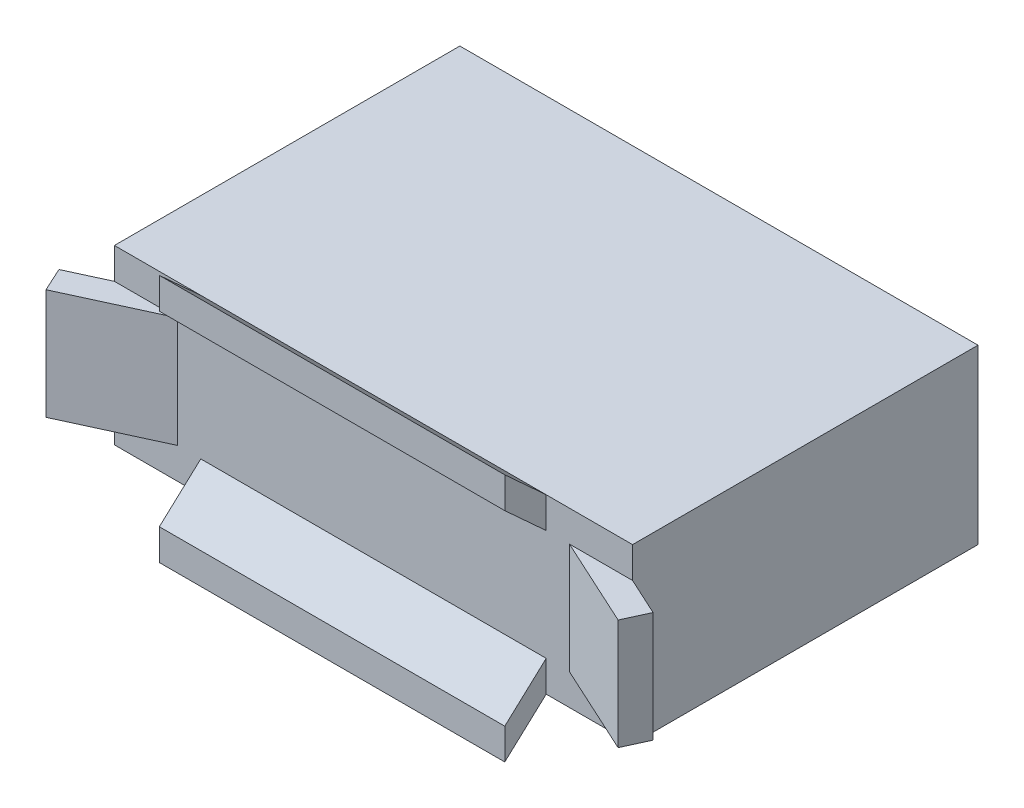
ISO-10303-21;
HEADER;
FILE_DESCRIPTION(('STEP AP214'),'2;1');
FILE_NAME('part.step','',(''),(''),'','','');
FILE_SCHEMA(('AUTOMOTIVE_DESIGN { 1 0 10303 214 1 1 1 1 }'));
ENDSEC;
DATA;
#1=APPLICATION_CONTEXT('core data for automotive mechanical design processes');
#2=APPLICATION_PROTOCOL_DEFINITION('international standard','automotive_design',2000,#1);
#3=PRODUCT_CONTEXT('',#1,'mechanical');
#4=PRODUCT('Part','Part','',(#3));
#5=PRODUCT_RELATED_PRODUCT_CATEGORY('part','',(#4));
#6=PRODUCT_DEFINITION_FORMATION('','',#4);
#7=PRODUCT_DEFINITION_CONTEXT('part definition',#1,'design');
#8=PRODUCT_DEFINITION('design','',#6,#7);
#9=PRODUCT_DEFINITION_SHAPE('','',#8);
#10=(LENGTH_UNIT() NAMED_UNIT(*) SI_UNIT(.MILLI.,.METRE.));
#11=(NAMED_UNIT(*) PLANE_ANGLE_UNIT() SI_UNIT($,.RADIAN.));
#12=(NAMED_UNIT(*) SI_UNIT($,.STERADIAN.) SOLID_ANGLE_UNIT());
#13=UNCERTAINTY_MEASURE_WITH_UNIT(LENGTH_MEASURE(1.E-05),#10,'distance_accuracy_value','');
#14=(GEOMETRIC_REPRESENTATION_CONTEXT(3) GLOBAL_UNCERTAINTY_ASSIGNED_CONTEXT((#13)) GLOBAL_UNIT_ASSIGNED_CONTEXT((#10,
#11,#12)) REPRESENTATION_CONTEXT('',''));
#15=CARTESIAN_POINT('',(0.,0.,0.));
#16=DIRECTION('',(0.,0.,1.));
#17=DIRECTION('',(1.,0.,0.));
#18=AXIS2_PLACEMENT_3D('',#15,#16,#17);
#19=CARTESIAN_POINT('',(-3.75,-1.25,2.5));
#20=DIRECTION('',(0.,0.,1.));
#21=DIRECTION('',(1.,0.,0.));
#22=AXIS2_PLACEMENT_3D('',#19,#20,#21);
#23=PLANE('',#22);
#24=DIRECTION('',(0.,1.,0.));
#25=VECTOR('',#24,1.);
#26=CARTESIAN_POINT('',(-2.5,-0.800797037665039,2.5));
#27=LINE('',#26,#25);
#28=CARTESIAN_POINT('',(-2.5,-1.25,2.5));
#29=VERTEX_POINT('',#28);
#30=CARTESIAN_POINT('',(-2.5,-0.800797037665041,2.5));
#31=VERTEX_POINT('',#30);
#32=EDGE_CURVE('E49',#29,#31,#27,.T.);
#33=ORIENTED_EDGE('',*,*,#32,.T.);
#34=DIRECTION('',(1.,0.,0.));
#35=VECTOR('',#34,1.);
#36=CARTESIAN_POINT('',(-2.5,-0.800797037665039,2.5));
#37=LINE('',#36,#35);
#38=CARTESIAN_POINT('',(2.5,-0.800797037665039,2.5));
#39=VERTEX_POINT('',#38);
#40=EDGE_CURVE('E53',#31,#39,#37,.T.);
#41=ORIENTED_EDGE('',*,*,#40,.T.);
#42=DIRECTION('',(0.,1.,0.));
#43=VECTOR('',#42,1.);
#44=CARTESIAN_POINT('',(2.5,-0.800797037665039,2.5));
#45=LINE('',#44,#43);
#46=CARTESIAN_POINT('',(2.5,-1.25,2.5));
#47=VERTEX_POINT('',#46);
#48=EDGE_CURVE('E192',#47,#39,#45,.T.);
#49=ORIENTED_EDGE('',*,*,#48,.F.);
#50=DIRECTION('',(1.,0.,0.));
#51=VECTOR('',#50,1.);
#52=CARTESIAN_POINT('',(-3.75,-1.25,2.5));
#53=LINE('',#52,#51);
#54=CARTESIAN_POINT('',(3.75,-1.25,2.5));
#55=VERTEX_POINT('',#54);
#56=EDGE_CURVE('E362',#47,#55,#53,.T.);
#57=ORIENTED_EDGE('',*,*,#56,.T.);
#58=DIRECTION('',(0.,1.,0.));
#59=VECTOR('',#58,1.);
#60=CARTESIAN_POINT('',(3.75,-1.25,2.5));
#61=LINE('',#60,#59);
#62=CARTESIAN_POINT('',(3.75,-0.8,2.49999999999999));
#63=VERTEX_POINT('',#62);
#64=EDGE_CURVE('E11',#55,#63,#61,.T.);
#65=ORIENTED_EDGE('',*,*,#64,.T.);
#66=DIRECTION('',(-1.,0.,0.));
#67=VECTOR('',#66,1.);
#68=CARTESIAN_POINT('',(3.75,-0.8,2.49999999999999));
#69=LINE('',#68,#67);
#70=CARTESIAN_POINT('',(2.83575929154418,-0.8,2.49999999999999));
#71=VERTEX_POINT('',#70);
#72=EDGE_CURVE('E254',#63,#71,#69,.T.);
#73=ORIENTED_EDGE('',*,*,#72,.T.);
#74=DIRECTION('',(0.,1.,0.));
#75=VECTOR('',#74,1.);
#76=CARTESIAN_POINT('',(2.83575929154418,-0.8,2.49999999999999));
#77=LINE('',#76,#75);
#78=CARTESIAN_POINT('',(2.83575929154418,0.8,2.49999999999999));
#79=VERTEX_POINT('',#78);
#80=EDGE_CURVE('E269',#71,#79,#77,.T.);
#81=ORIENTED_EDGE('',*,*,#80,.T.);
#82=DIRECTION('',(-1.,0.,0.));
#83=VECTOR('',#82,1.);
#84=CARTESIAN_POINT('',(3.75,0.8,2.49999999999999));
#85=LINE('',#84,#83);
#86=CARTESIAN_POINT('',(3.75,0.8,2.5));
#87=VERTEX_POINT('',#86);
#88=EDGE_CURVE('E243',#87,#79,#85,.T.);
#89=ORIENTED_EDGE('',*,*,#88,.F.);
#90=CARTESIAN_POINT('',(3.75,1.25,2.5));
#91=VERTEX_POINT('',#90);
#92=EDGE_CURVE('E41',#87,#91,#61,.T.);
#93=ORIENTED_EDGE('',*,*,#92,.T.);
#94=DIRECTION('',(1.,0.,0.));
#95=VECTOR('',#94,1.);
#96=CARTESIAN_POINT('',(-3.75,1.25,2.5));
#97=LINE('',#96,#95);
#98=CARTESIAN_POINT('',(2.5,1.25,2.5));
#99=VERTEX_POINT('',#98);
#100=EDGE_CURVE('E352',#99,#91,#97,.T.);
#101=ORIENTED_EDGE('',*,*,#100,.F.);
#102=DIRECTION('',(0.,1.,0.));
#103=VECTOR('',#102,1.);
#104=CARTESIAN_POINT('',(2.5,0.800797037665039,2.5));
#105=LINE('',#104,#103);
#106=CARTESIAN_POINT('',(2.5,0.800797037665039,2.5));
#107=VERTEX_POINT('',#106);
#108=EDGE_CURVE('E205',#107,#99,#105,.T.);
#109=ORIENTED_EDGE('',*,*,#108,.F.);
#110=DIRECTION('',(1.,0.,0.));
#111=VECTOR('',#110,1.);
#112=CARTESIAN_POINT('',(-2.5,0.800797037665039,2.5));
#113=LINE('',#112,#111);
#114=CARTESIAN_POINT('',(-2.5,0.800797037665039,2.5));
#115=VERTEX_POINT('',#114);
#116=EDGE_CURVE('E233',#115,#107,#113,.T.);
#117=ORIENTED_EDGE('',*,*,#116,.F.);
#118=DIRECTION('',(0.,1.,0.));
#119=VECTOR('',#118,1.);
#120=CARTESIAN_POINT('',(-2.5,0.800797037665039,2.5));
#121=LINE('',#120,#119);
#122=CARTESIAN_POINT('',(-2.5,1.25,2.5));
#123=VERTEX_POINT('',#122);
#124=EDGE_CURVE('E220',#115,#123,#121,.T.);
#125=ORIENTED_EDGE('',*,*,#124,.T.);
#126=CARTESIAN_POINT('',(-3.75,1.25,2.5));
#127=VERTEX_POINT('',#126);
#128=EDGE_CURVE('E318',#127,#123,#97,.T.);
#129=ORIENTED_EDGE('',*,*,#128,.F.);
#130=DIRECTION('',(0.,1.,0.));
#131=VECTOR('',#130,1.);
#132=CARTESIAN_POINT('',(-3.75,-1.25,2.5));
#133=LINE('',#132,#131);
#134=CARTESIAN_POINT('',(-3.75,0.8,2.5));
#135=VERTEX_POINT('',#134);
#136=EDGE_CURVE('E291',#135,#127,#133,.T.);
#137=ORIENTED_EDGE('',*,*,#136,.F.);
#138=DIRECTION('',(-1.,0.,0.));
#139=VECTOR('',#138,1.);
#140=CARTESIAN_POINT('',(-3.75,0.8,2.5));
#141=LINE('',#140,#139);
#142=CARTESIAN_POINT('',(-2.83575929154417,0.8,2.5));
#143=VERTEX_POINT('',#142);
#144=EDGE_CURVE('E266',#143,#135,#141,.T.);
#145=ORIENTED_EDGE('',*,*,#144,.F.);
#146=DIRECTION('',(0.,1.,0.));
#147=VECTOR('',#146,1.);
#148=CARTESIAN_POINT('',(-2.83575929154417,-0.8,2.5));
#149=LINE('',#148,#147);
#150=CARTESIAN_POINT('',(-2.83575929154417,-0.8,2.5));
#151=VERTEX_POINT('',#150);
#152=EDGE_CURVE('E330',#151,#143,#149,.T.);
#153=ORIENTED_EDGE('',*,*,#152,.F.);
#154=DIRECTION('',(-1.,0.,0.));
#155=VECTOR('',#154,1.);
#156=CARTESIAN_POINT('',(-3.75,-0.8,2.5));
#157=LINE('',#156,#155);
#158=CARTESIAN_POINT('',(-3.75,-0.8,2.5));
#159=VERTEX_POINT('',#158);
#160=EDGE_CURVE('E281',#151,#159,#157,.T.);
#161=ORIENTED_EDGE('',*,*,#160,.T.);
#162=CARTESIAN_POINT('',(-3.75,-1.25,2.5));
#163=VERTEX_POINT('',#162);
#164=EDGE_CURVE('E322',#163,#159,#133,.T.);
#165=ORIENTED_EDGE('',*,*,#164,.F.);
#166=EDGE_CURVE('E363',#163,#29,#53,.T.);
#167=ORIENTED_EDGE('',*,*,#166,.T.);
#168=EDGE_LOOP('',(#33,#41,#49,#57,#65,#73,#81,#89,#93,#101,#109,#117,#125,#129,#137,#145,#153,
#161,#165,#167));
#169=FACE_BOUND('',#168,.T.);
#170=ADVANCED_FACE('F32',(#169),#23,.T.);
#171=CARTESIAN_POINT('',(3.75,-1.25,2.5));
#172=DIRECTION('',(1.,0.,0.));
#173=DIRECTION('',(0.,0.,-1.));
#174=AXIS2_PLACEMENT_3D('',#171,#172,#173);
#175=PLANE('',#174);
#176=DIRECTION('',(0.,1.,0.));
#177=VECTOR('',#176,1.);
#178=CARTESIAN_POINT('',(3.75,-1.25,-2.5));
#179=LINE('',#178,#177);
#180=CARTESIAN_POINT('',(3.75,-1.25,-2.5));
#181=VERTEX_POINT('',#180);
#182=CARTESIAN_POINT('',(3.75,1.25,-2.5));
#183=VERTEX_POINT('',#182);
#184=EDGE_CURVE('E364',#181,#183,#179,.T.);
#185=ORIENTED_EDGE('',*,*,#184,.T.);
#186=DIRECTION('',(0.,0.,-1.));
#187=VECTOR('',#186,1.);
#188=CARTESIAN_POINT('',(3.75,1.25,2.5));
#189=LINE('',#188,#187);
#190=EDGE_CURVE('E342',#91,#183,#189,.T.);
#191=ORIENTED_EDGE('',*,*,#190,.F.);
#192=ORIENTED_EDGE('',*,*,#92,.F.);
#193=DIRECTION('',(0.,1.,0.));
#194=VECTOR('',#193,1.);
#195=CARTESIAN_POINT('',(3.75,-0.8,2.49999999999999));
#196=LINE('',#195,#194);
#197=EDGE_CURVE('E263',#63,#87,#196,.T.);
#198=ORIENTED_EDGE('',*,*,#197,.F.);
#199=ORIENTED_EDGE('',*,*,#64,.F.);
#200=DIRECTION('',(0.,0.,-1.));
#201=VECTOR('',#200,1.);
#202=CARTESIAN_POINT('',(3.75,-1.25,2.5));
#203=LINE('',#202,#201);
#204=EDGE_CURVE('E354',#55,#181,#203,.T.);
#205=ORIENTED_EDGE('',*,*,#204,.T.);
#206=EDGE_LOOP('',(#185,#191,#192,#198,#199,#205));
#207=FACE_BOUND('',#206,.T.);
#208=ADVANCED_FACE('F34',(#207),#175,.T.);
#209=CARTESIAN_POINT('',(-3.75,-1.25,2.5));
#210=DIRECTION('',(-1.,0.,0.));
#211=DIRECTION('',(0.,0.,1.));
#212=AXIS2_PLACEMENT_3D('',#209,#210,#211);
#213=PLANE('',#212);
#214=ORIENTED_EDGE('',*,*,#164,.T.);
#215=DIRECTION('',(0.,1.,0.));
#216=VECTOR('',#215,1.);
#217=CARTESIAN_POINT('',(-3.75,-0.8,2.5));
#218=LINE('',#217,#216);
#219=EDGE_CURVE('E298',#159,#135,#218,.T.);
#220=ORIENTED_EDGE('',*,*,#219,.T.);
#221=ORIENTED_EDGE('',*,*,#136,.T.);
#222=DIRECTION('',(0.,0.,1.));
#223=VECTOR('',#222,1.);
#224=CARTESIAN_POINT('',(-3.75,1.25,2.5));
#225=LINE('',#224,#223);
#226=CARTESIAN_POINT('',(-3.75,1.25,-2.5));
#227=VERTEX_POINT('',#226);
#228=EDGE_CURVE('E350',#227,#127,#225,.T.);
#229=ORIENTED_EDGE('',*,*,#228,.F.);
#230=DIRECTION('',(0.,1.,0.));
#231=VECTOR('',#230,1.);
#232=CARTESIAN_POINT('',(-3.75,-1.25,-2.5));
#233=LINE('',#232,#231);
#234=CARTESIAN_POINT('',(-3.75,-1.25,-2.5));
#235=VERTEX_POINT('',#234);
#236=EDGE_CURVE('E323',#235,#227,#233,.T.);
#237=ORIENTED_EDGE('',*,*,#236,.F.);
#238=DIRECTION('',(0.,0.,1.));
#239=VECTOR('',#238,1.);
#240=CARTESIAN_POINT('',(-3.75,-1.25,2.5));
#241=LINE('',#240,#239);
#242=EDGE_CURVE('E360',#235,#163,#241,.T.);
#243=ORIENTED_EDGE('',*,*,#242,.T.);
#244=EDGE_LOOP('',(#214,#220,#221,#229,#237,#243));
#245=FACE_BOUND('',#244,.T.);
#246=ADVANCED_FACE('F326',(#245),#213,.T.);
#247=CARTESIAN_POINT('',(-3.75,-1.25,-2.5));
#248=DIRECTION('',(0.,0.,-1.));
#249=DIRECTION('',(-1.,0.,0.));
#250=AXIS2_PLACEMENT_3D('',#247,#248,#249);
#251=PLANE('',#250);
#252=ORIENTED_EDGE('',*,*,#236,.T.);
#253=DIRECTION('',(-1.,0.,0.));
#254=VECTOR('',#253,1.);
#255=CARTESIAN_POINT('',(-3.75,1.25,-2.5));
#256=LINE('',#255,#254);
#257=EDGE_CURVE('E347',#183,#227,#256,.T.);
#258=ORIENTED_EDGE('',*,*,#257,.F.);
#259=ORIENTED_EDGE('',*,*,#184,.F.);
#260=DIRECTION('',(-1.,0.,0.));
#261=VECTOR('',#260,1.);
#262=CARTESIAN_POINT('',(-3.75,-1.25,-2.5));
#263=LINE('',#262,#261);
#264=EDGE_CURVE('E357',#181,#235,#263,.T.);
#265=ORIENTED_EDGE('',*,*,#264,.T.);
#266=EDGE_LOOP('',(#252,#258,#259,#265));
#267=FACE_BOUND('',#266,.T.);
#268=ADVANCED_FACE('F373',(#267),#251,.T.);
#269=CARTESIAN_POINT('',(0.,-1.25,0.));
#270=DIRECTION('',(0.,-1.,0.));
#271=DIRECTION('',(0.,0.,-1.));
#272=AXIS2_PLACEMENT_3D('',#269,#270,#271);
#273=PLANE('',#272);
#274=ORIENTED_EDGE('',*,*,#204,.F.);
#275=ORIENTED_EDGE('',*,*,#56,.F.);
#276=DIRECTION('',(1.,0.,0.));
#277=VECTOR('',#276,1.);
#278=CARTESIAN_POINT('',(-2.5,-1.25,2.5));
#279=LINE('',#278,#277);
#280=EDGE_CURVE('E206',#29,#47,#279,.T.);
#281=ORIENTED_EDGE('',*,*,#280,.F.);
#282=ORIENTED_EDGE('',*,*,#166,.F.);
#283=ORIENTED_EDGE('',*,*,#242,.F.);
#284=ORIENTED_EDGE('',*,*,#264,.F.);
#285=EDGE_LOOP('',(#274,#275,#281,#282,#283,#284));
#286=FACE_BOUND('',#285,.T.);
#287=ADVANCED_FACE('F403',(#286),#273,.T.);
#288=CARTESIAN_POINT('',(0.,1.25,0.));
#289=DIRECTION('',(0.,-1.,0.));
#290=DIRECTION('',(0.,0.,-1.));
#291=AXIS2_PLACEMENT_3D('',#288,#289,#290);
#292=PLANE('',#291);
#293=ORIENTED_EDGE('',*,*,#190,.T.);
#294=ORIENTED_EDGE('',*,*,#257,.T.);
#295=ORIENTED_EDGE('',*,*,#228,.T.);
#296=ORIENTED_EDGE('',*,*,#128,.T.);
#297=DIRECTION('',(1.,0.,0.));
#298=VECTOR('',#297,1.);
#299=CARTESIAN_POINT('',(-2.5,1.25,2.5));
#300=LINE('',#299,#298);
#301=EDGE_CURVE('E232',#123,#99,#300,.T.);
#302=ORIENTED_EDGE('',*,*,#301,.T.);
#303=ORIENTED_EDGE('',*,*,#100,.T.);
#304=EDGE_LOOP('',(#293,#294,#295,#296,#302,#303));
#305=FACE_BOUND('',#304,.T.);
#306=ADVANCED_FACE('F377',(#305),#292,.F.);
#307=CARTESIAN_POINT('',(-4.14038935994351,-0.8,3.1));
#308=DIRECTION('',(0.417830984273313,0.,0.908524775986431));
#309=DIRECTION('',(0.908524775986431,0.,-0.417830984273313));
#310=AXIS2_PLACEMENT_3D('',#307,#308,#309);
#311=PLANE('',#310);
#312=ORIENTED_EDGE('',*,*,#152,.T.);
#313=DIRECTION('',(0.908524775986431,0.,-0.417830984273313));
#314=VECTOR('',#313,1.);
#315=CARTESIAN_POINT('',(-4.14038935994351,0.8,3.1));
#316=LINE('',#315,#314);
#317=CARTESIAN_POINT('',(-4.14038935994351,0.8,3.1));
#318=VERTEX_POINT('',#317);
#319=EDGE_CURVE('E277',#318,#143,#316,.T.);
#320=ORIENTED_EDGE('',*,*,#319,.F.);
#321=DIRECTION('',(0.,1.,0.));
#322=VECTOR('',#321,1.);
#323=CARTESIAN_POINT('',(-4.14038935994351,-0.8,3.1));
#324=LINE('',#323,#322);
#325=CARTESIAN_POINT('',(-4.14038935994351,-0.8,3.1));
#326=VERTEX_POINT('',#325);
#327=EDGE_CURVE('E338',#326,#318,#324,.T.);
#328=ORIENTED_EDGE('',*,*,#327,.F.);
#329=DIRECTION('',(0.908524775986431,0.,-0.417830984273313));
#330=VECTOR('',#329,1.);
#331=CARTESIAN_POINT('',(-4.14038935994351,-0.8,3.1));
#332=LINE('',#331,#330);
#333=EDGE_CURVE('E302',#326,#151,#332,.T.);
#334=ORIENTED_EDGE('',*,*,#333,.T.);
#335=EDGE_LOOP('',(#312,#320,#328,#334));
#336=FACE_BOUND('',#335,.T.);
#337=ADVANCED_FACE('F337',(#336),#311,.T.);
#338=CARTESIAN_POINT('',(-4.3,-0.8,2.75294526624308));
#339=DIRECTION('',(-0.90852477598643,0.,0.417830984273314));
#340=DIRECTION('',(0.417830984273314,0.,0.908524775986431));
#341=AXIS2_PLACEMENT_3D('',#338,#339,#340);
#342=PLANE('',#341);
#343=ORIENTED_EDGE('',*,*,#327,.T.);
#344=DIRECTION('',(0.417830984273314,0.,0.90852477598643));
#345=VECTOR('',#344,1.);
#346=CARTESIAN_POINT('',(-4.3,0.8,2.75294526624308));
#347=LINE('',#346,#345);
#348=CARTESIAN_POINT('',(-4.3,0.8,2.75294526624308));
#349=VERTEX_POINT('',#348);
#350=EDGE_CURVE('E274',#349,#318,#347,.T.);
#351=ORIENTED_EDGE('',*,*,#350,.F.);
#352=DIRECTION('',(0.,1.,0.));
#353=VECTOR('',#352,1.);
#354=CARTESIAN_POINT('',(-4.3,-0.8,2.75294526624308));
#355=LINE('',#354,#353);
#356=CARTESIAN_POINT('',(-4.3,-0.8,2.75294526624308));
#357=VERTEX_POINT('',#356);
#358=EDGE_CURVE('E301',#357,#349,#355,.T.);
#359=ORIENTED_EDGE('',*,*,#358,.F.);
#360=DIRECTION('',(0.417830984273314,0.,0.90852477598643));
#361=VECTOR('',#360,1.);
#362=CARTESIAN_POINT('',(-4.3,-0.8,2.75294526624308));
#363=LINE('',#362,#361);
#364=EDGE_CURVE('E284',#357,#326,#363,.T.);
#365=ORIENTED_EDGE('',*,*,#364,.T.);
#366=EDGE_LOOP('',(#343,#351,#359,#365));
#367=FACE_BOUND('',#366,.T.);
#368=ADVANCED_FACE('F438',(#367),#342,.T.);
#369=CARTESIAN_POINT('',(-3.75,-0.8,2.5));
#370=DIRECTION('',(-0.417830984273313,0.,-0.908524775986431));
#371=DIRECTION('',(-0.908524775986431,0.,0.417830984273313));
#372=AXIS2_PLACEMENT_3D('',#369,#370,#371);
#373=PLANE('',#372);
#374=ORIENTED_EDGE('',*,*,#358,.T.);
#375=DIRECTION('',(-0.908524775986431,0.,0.417830984273313));
#376=VECTOR('',#375,1.);
#377=CARTESIAN_POINT('',(-3.75,0.8,2.5));
#378=LINE('',#377,#376);
#379=EDGE_CURVE('E278',#135,#349,#378,.T.);
#380=ORIENTED_EDGE('',*,*,#379,.F.);
#381=ORIENTED_EDGE('',*,*,#219,.F.);
#382=DIRECTION('',(-0.908524775986431,0.,0.417830984273313));
#383=VECTOR('',#382,1.);
#384=CARTESIAN_POINT('',(-3.75,-0.8,2.5));
#385=LINE('',#384,#383);
#386=EDGE_CURVE('E290',#159,#357,#385,.T.);
#387=ORIENTED_EDGE('',*,*,#386,.T.);
#388=EDGE_LOOP('',(#374,#380,#381,#387));
#389=FACE_BOUND('',#388,.T.);
#390=ADVANCED_FACE('F329',(#389),#373,.T.);
#391=CARTESIAN_POINT('',(0.,-0.8,0.));
#392=DIRECTION('',(0.,-1.,0.));
#393=DIRECTION('',(0.,0.,-1.));
#394=AXIS2_PLACEMENT_3D('',#391,#392,#393);
#395=PLANE('',#394);
#396=ORIENTED_EDGE('',*,*,#160,.F.);
#397=ORIENTED_EDGE('',*,*,#333,.F.);
#398=ORIENTED_EDGE('',*,*,#364,.F.);
#399=ORIENTED_EDGE('',*,*,#386,.F.);
#400=EDGE_LOOP('',(#396,#397,#398,#399));
#401=FACE_BOUND('',#400,.T.);
#402=ADVANCED_FACE('F334',(#401),#395,.T.);
#403=CARTESIAN_POINT('',(0.,0.8,0.));
#404=DIRECTION('',(0.,-1.,0.));
#405=DIRECTION('',(0.,0.,-1.));
#406=AXIS2_PLACEMENT_3D('',#403,#404,#405);
#407=PLANE('',#406);
#408=ORIENTED_EDGE('',*,*,#144,.T.);
#409=ORIENTED_EDGE('',*,*,#379,.T.);
#410=ORIENTED_EDGE('',*,*,#350,.T.);
#411=ORIENTED_EDGE('',*,*,#319,.T.);
#412=EDGE_LOOP('',(#408,#409,#410,#411));
#413=FACE_BOUND('',#412,.T.);
#414=ADVANCED_FACE('F312',(#413),#407,.F.);
#415=CARTESIAN_POINT('',(3.75,-0.8,2.49999999999999));
#416=DIRECTION('',(0.417830984273311,0.,-0.908524775986432));
#417=DIRECTION('',(-0.908524775986432,0.,-0.417830984273311));
#418=AXIS2_PLACEMENT_3D('',#415,#416,#417);
#419=PLANE('',#418);
#420=ORIENTED_EDGE('',*,*,#197,.T.);
#421=DIRECTION('',(-0.908524775986432,0.,-0.417830984273311));
#422=VECTOR('',#421,1.);
#423=CARTESIAN_POINT('',(3.75,0.8,2.49999999999999));
#424=LINE('',#423,#422);
#425=CARTESIAN_POINT('',(4.3,0.8,2.75294526624307));
#426=VERTEX_POINT('',#425);
#427=EDGE_CURVE('E235',#426,#87,#424,.T.);
#428=ORIENTED_EDGE('',*,*,#427,.F.);
#429=DIRECTION('',(0.,1.,0.));
#430=VECTOR('',#429,1.);
#431=CARTESIAN_POINT('',(4.3,-0.8,2.75294526624307));
#432=LINE('',#431,#430);
#433=CARTESIAN_POINT('',(4.3,-0.8,2.75294526624307));
#434=VERTEX_POINT('',#433);
#435=EDGE_CURVE('E264',#434,#426,#432,.T.);
#436=ORIENTED_EDGE('',*,*,#435,.F.);
#437=DIRECTION('',(-0.908524775986432,0.,-0.417830984273311));
#438=VECTOR('',#437,1.);
#439=CARTESIAN_POINT('',(3.75,-0.8,2.49999999999999));
#440=LINE('',#439,#438);
#441=EDGE_CURVE('E251',#434,#63,#440,.T.);
#442=ORIENTED_EDGE('',*,*,#441,.T.);
#443=EDGE_LOOP('',(#420,#428,#436,#442));
#444=FACE_BOUND('',#443,.T.);
#445=ADVANCED_FACE('F397',(#444),#419,.T.);
#446=CARTESIAN_POINT('',(4.3,-0.8,2.75294526624307));
#447=DIRECTION('',(0.908524775986433,0.,0.417830984273309));
#448=DIRECTION('',(0.417830984273309,0.,-0.908524775986433));
#449=AXIS2_PLACEMENT_3D('',#446,#447,#448);
#450=PLANE('',#449);
#451=ORIENTED_EDGE('',*,*,#435,.T.);
#452=DIRECTION('',(0.417830984273309,0.,-0.908524775986433));
#453=VECTOR('',#452,1.);
#454=CARTESIAN_POINT('',(4.3,0.8,2.75294526624307));
#455=LINE('',#454,#453);
#456=CARTESIAN_POINT('',(4.14038935994352,0.8,3.09999999999999));
#457=VERTEX_POINT('',#456);
#458=EDGE_CURVE('E248',#457,#426,#455,.T.);
#459=ORIENTED_EDGE('',*,*,#458,.F.);
#460=DIRECTION('',(0.,1.,0.));
#461=VECTOR('',#460,1.);
#462=CARTESIAN_POINT('',(4.14038935994352,-0.8,3.09999999999999));
#463=LINE('',#462,#461);
#464=CARTESIAN_POINT('',(4.14038935994352,-0.8,3.09999999999999));
#465=VERTEX_POINT('',#464);
#466=EDGE_CURVE('E267',#465,#457,#463,.T.);
#467=ORIENTED_EDGE('',*,*,#466,.F.);
#468=DIRECTION('',(0.417830984273309,0.,-0.908524775986433));
#469=VECTOR('',#468,1.);
#470=CARTESIAN_POINT('',(4.3,-0.8,2.75294526624307));
#471=LINE('',#470,#469);
#472=EDGE_CURVE('E260',#465,#434,#471,.T.);
#473=ORIENTED_EDGE('',*,*,#472,.T.);
#474=EDGE_LOOP('',(#451,#459,#467,#473));
#475=FACE_BOUND('',#474,.T.);
#476=ADVANCED_FACE('F395',(#475),#450,.T.);
#477=CARTESIAN_POINT('',(4.14038935994352,-0.8,3.09999999999999));
#478=DIRECTION('',(-0.417830984273311,0.,0.908524775986432));
#479=DIRECTION('',(0.908524775986432,0.,0.417830984273311));
#480=AXIS2_PLACEMENT_3D('',#477,#478,#479);
#481=PLANE('',#480);
#482=ORIENTED_EDGE('',*,*,#466,.T.);
#483=DIRECTION('',(0.908524775986432,0.,0.417830984273311));
#484=VECTOR('',#483,1.);
#485=CARTESIAN_POINT('',(4.14038935994352,0.8,3.09999999999999));
#486=LINE('',#485,#484);
#487=EDGE_CURVE('E245',#79,#457,#486,.T.);
#488=ORIENTED_EDGE('',*,*,#487,.F.);
#489=ORIENTED_EDGE('',*,*,#80,.F.);
#490=DIRECTION('',(0.908524775986432,0.,0.417830984273311));
#491=VECTOR('',#490,1.);
#492=CARTESIAN_POINT('',(4.14038935994352,-0.8,3.09999999999999));
#493=LINE('',#492,#491);
#494=EDGE_CURVE('E257',#71,#465,#493,.T.);
#495=ORIENTED_EDGE('',*,*,#494,.T.);
#496=EDGE_LOOP('',(#482,#488,#489,#495));
#497=FACE_BOUND('',#496,.T.);
#498=ADVANCED_FACE('F391',(#497),#481,.T.);
#499=CARTESIAN_POINT('',(0.,-0.8,0.));
#500=DIRECTION('',(0.,-1.,0.));
#501=DIRECTION('',(0.,0.,-1.));
#502=AXIS2_PLACEMENT_3D('',#499,#500,#501);
#503=PLANE('',#502);
#504=ORIENTED_EDGE('',*,*,#441,.F.);
#505=ORIENTED_EDGE('',*,*,#472,.F.);
#506=ORIENTED_EDGE('',*,*,#494,.F.);
#507=ORIENTED_EDGE('',*,*,#72,.F.);
#508=EDGE_LOOP('',(#504,#505,#506,#507));
#509=FACE_BOUND('',#508,.T.);
#510=ADVANCED_FACE('F400',(#509),#503,.T.);
#511=CARTESIAN_POINT('',(0.,0.8,0.));
#512=DIRECTION('',(0.,-1.,0.));
#513=DIRECTION('',(0.,0.,-1.));
#514=AXIS2_PLACEMENT_3D('',#511,#512,#513);
#515=PLANE('',#514);
#516=ORIENTED_EDGE('',*,*,#427,.T.);
#517=ORIENTED_EDGE('',*,*,#88,.T.);
#518=ORIENTED_EDGE('',*,*,#487,.T.);
#519=ORIENTED_EDGE('',*,*,#458,.T.);
#520=EDGE_LOOP('',(#516,#517,#518,#519));
#521=FACE_BOUND('',#520,.T.);
#522=ADVANCED_FACE('F387',(#521),#515,.F.);
#523=CARTESIAN_POINT('',(-2.5,1.35079703766504,3.1));
#524=DIRECTION('',(0.,-0.737154140200741,0.675724628517346));
#525=DIRECTION('',(0.,-0.675724628517346,-0.737154140200741));
#526=AXIS2_PLACEMENT_3D('',#523,#524,#525);
#527=PLANE('',#526);
#528=ORIENTED_EDGE('',*,*,#116,.T.);
#529=DIRECTION('',(0.,-0.675724628517346,-0.737154140200741));
#530=VECTOR('',#529,1.);
#531=CARTESIAN_POINT('',(2.5,1.35079703766504,3.1));
#532=LINE('',#531,#530);
#533=CARTESIAN_POINT('',(2.5,1.35079703766504,3.1));
#534=VERTEX_POINT('',#533);
#535=EDGE_CURVE('E217',#534,#107,#532,.T.);
#536=ORIENTED_EDGE('',*,*,#535,.F.);
#537=DIRECTION('',(1.,0.,0.));
#538=VECTOR('',#537,1.);
#539=CARTESIAN_POINT('',(-2.5,1.35079703766504,3.1));
#540=LINE('',#539,#538);
#541=CARTESIAN_POINT('',(-2.5,1.35079703766504,3.1));
#542=VERTEX_POINT('',#541);
#543=EDGE_CURVE('E236',#542,#534,#540,.T.);
#544=ORIENTED_EDGE('',*,*,#543,.F.);
#545=DIRECTION('',(0.,-0.675724628517346,-0.737154140200741));
#546=VECTOR('',#545,1.);
#547=CARTESIAN_POINT('',(-2.5,1.35079703766504,3.1));
#548=LINE('',#547,#546);
#549=EDGE_CURVE('E229',#542,#115,#548,.T.);
#550=ORIENTED_EDGE('',*,*,#549,.T.);
#551=EDGE_LOOP('',(#528,#536,#544,#550));
#552=FACE_BOUND('',#551,.T.);
#553=ADVANCED_FACE('F460',(#552),#527,.T.);
#554=CARTESIAN_POINT('',(-2.5,1.8,3.1));
#555=DIRECTION('',(0.,0.,1.));
#556=DIRECTION('',(1.,0.,0.));
#557=AXIS2_PLACEMENT_3D('',#554,#555,#556);
#558=PLANE('',#557);
#559=ORIENTED_EDGE('',*,*,#543,.T.);
#560=DIRECTION('',(0.,-1.,0.));
#561=VECTOR('',#560,1.);
#562=CARTESIAN_POINT('',(2.5,1.8,3.1));
#563=LINE('',#562,#561);
#564=CARTESIAN_POINT('',(2.5,1.8,3.1));
#565=VERTEX_POINT('',#564);
#566=EDGE_CURVE('E214',#565,#534,#563,.T.);
#567=ORIENTED_EDGE('',*,*,#566,.F.);
#568=DIRECTION('',(1.,0.,0.));
#569=VECTOR('',#568,1.);
#570=CARTESIAN_POINT('',(-2.5,1.8,3.1));
#571=LINE('',#570,#569);
#572=CARTESIAN_POINT('',(-2.5,1.8,3.1));
#573=VERTEX_POINT('',#572);
#574=EDGE_CURVE('E238',#573,#565,#571,.T.);
#575=ORIENTED_EDGE('',*,*,#574,.F.);
#576=DIRECTION('',(0.,-1.,0.));
#577=VECTOR('',#576,1.);
#578=CARTESIAN_POINT('',(-2.5,1.8,3.1));
#579=LINE('',#578,#577);
#580=EDGE_CURVE('E226',#573,#542,#579,.T.);
#581=ORIENTED_EDGE('',*,*,#580,.T.);
#582=EDGE_LOOP('',(#559,#567,#575,#581));
#583=FACE_BOUND('',#582,.T.);
#584=ADVANCED_FACE('F465',(#583),#558,.T.);
#585=CARTESIAN_POINT('',(-2.5,1.25,2.5));
#586=DIRECTION('',(0.,0.737154140200741,-0.675724628517346));
#587=DIRECTION('',(0.,0.675724628517346,0.737154140200741));
#588=AXIS2_PLACEMENT_3D('',#585,#586,#587);
#589=PLANE('',#588);
#590=ORIENTED_EDGE('',*,*,#574,.T.);
#591=DIRECTION('',(0.,0.675724628517346,0.737154140200741));
#592=VECTOR('',#591,1.);
#593=CARTESIAN_POINT('',(2.5,1.25,2.5));
#594=LINE('',#593,#592);
#595=EDGE_CURVE('E211',#99,#565,#594,.T.);
#596=ORIENTED_EDGE('',*,*,#595,.F.);
#597=ORIENTED_EDGE('',*,*,#301,.F.);
#598=DIRECTION('',(0.,0.675724628517346,0.737154140200741));
#599=VECTOR('',#598,1.);
#600=CARTESIAN_POINT('',(-2.5,1.25,2.5));
#601=LINE('',#600,#599);
#602=EDGE_CURVE('E223',#123,#573,#601,.T.);
#603=ORIENTED_EDGE('',*,*,#602,.T.);
#604=EDGE_LOOP('',(#590,#596,#597,#603));
#605=FACE_BOUND('',#604,.T.);
#606=ADVANCED_FACE('F461',(#605),#589,.T.);
#607=CARTESIAN_POINT('',(-2.5,0.,0.));
#608=DIRECTION('',(1.,0.,0.));
#609=DIRECTION('',(0.,0.,-1.));
#610=AXIS2_PLACEMENT_3D('',#607,#608,#609);
#611=PLANE('',#610);
#612=ORIENTED_EDGE('',*,*,#124,.F.);
#613=ORIENTED_EDGE('',*,*,#549,.F.);
#614=ORIENTED_EDGE('',*,*,#580,.F.);
#615=ORIENTED_EDGE('',*,*,#602,.F.);
#616=EDGE_LOOP('',(#612,#613,#614,#615));
#617=FACE_BOUND('',#616,.T.);
#618=ADVANCED_FACE('F464',(#617),#611,.F.);
#619=CARTESIAN_POINT('',(2.5,0.,0.));
#620=DIRECTION('',(1.,0.,0.));
#621=DIRECTION('',(0.,0.,-1.));
#622=AXIS2_PLACEMENT_3D('',#619,#620,#621);
#623=PLANE('',#622);
#624=ORIENTED_EDGE('',*,*,#108,.T.);
#625=ORIENTED_EDGE('',*,*,#595,.T.);
#626=ORIENTED_EDGE('',*,*,#566,.T.);
#627=ORIENTED_EDGE('',*,*,#535,.T.);
#628=EDGE_LOOP('',(#624,#625,#626,#627));
#629=FACE_BOUND('',#628,.T.);
#630=ADVANCED_FACE('F475',(#629),#623,.T.);
#631=CARTESIAN_POINT('',(-2.5,-1.35079703766504,3.1));
#632=DIRECTION('',(0.,0.737154140200741,0.675724628517346));
#633=DIRECTION('',(0.,-0.675724628517346,0.737154140200742));
#634=AXIS2_PLACEMENT_3D('',#631,#632,#633);
#635=PLANE('',#634);
#636=DIRECTION('',(1.,0.,0.));
#637=VECTOR('',#636,1.);
#638=CARTESIAN_POINT('',(-2.5,-1.35079703766504,3.1));
#639=LINE('',#638,#637);
#640=CARTESIAN_POINT('',(-2.5,-1.35079703766504,3.1));
#641=VERTEX_POINT('',#640);
#642=CARTESIAN_POINT('',(2.5,-1.35079703766504,3.1));
#643=VERTEX_POINT('',#642);
#644=EDGE_CURVE('E171',#641,#643,#639,.T.);
#645=ORIENTED_EDGE('',*,*,#644,.T.);
#646=DIRECTION('',(0.,-0.675724628517346,0.737154140200741));
#647=VECTOR('',#646,1.);
#648=CARTESIAN_POINT('',(2.5,-1.35079703766504,3.1));
#649=LINE('',#648,#647);
#650=EDGE_CURVE('E175',#39,#643,#649,.T.);
#651=ORIENTED_EDGE('',*,*,#650,.F.);
#652=ORIENTED_EDGE('',*,*,#40,.F.);
#653=DIRECTION('',(0.,-0.675724628517346,0.737154140200741));
#654=VECTOR('',#653,1.);
#655=CARTESIAN_POINT('',(-2.5,-1.35079703766504,3.1));
#656=LINE('',#655,#654);
#657=EDGE_CURVE('E177',#31,#641,#656,.T.);
#658=ORIENTED_EDGE('',*,*,#657,.T.);
#659=EDGE_LOOP('',(#645,#651,#652,#658));
#660=FACE_BOUND('',#659,.T.);
#661=ADVANCED_FACE('F173',(#660),#635,.T.);
#662=CARTESIAN_POINT('',(-2.5,-1.25,2.5));
#663=DIRECTION('',(0.,-0.737154140200741,-0.675724628517346));
#664=DIRECTION('',(0.,0.675724628517346,-0.737154140200741));
#665=AXIS2_PLACEMENT_3D('',#662,#663,#664);
#666=PLANE('',#665);
#667=ORIENTED_EDGE('',*,*,#280,.T.);
#668=DIRECTION('',(0.,0.675724628517346,-0.737154140200741));
#669=VECTOR('',#668,1.);
#670=CARTESIAN_POINT('',(2.5,-1.25,2.5));
#671=LINE('',#670,#669);
#672=CARTESIAN_POINT('',(2.5,-1.8,3.1));
#673=VERTEX_POINT('',#672);
#674=EDGE_CURVE('E189',#673,#47,#671,.T.);
#675=ORIENTED_EDGE('',*,*,#674,.F.);
#676=DIRECTION('',(1.,0.,0.));
#677=VECTOR('',#676,1.);
#678=CARTESIAN_POINT('',(-2.5,-1.8,3.1));
#679=LINE('',#678,#677);
#680=CARTESIAN_POINT('',(-2.5,-1.8,3.1));
#681=VERTEX_POINT('',#680);
#682=EDGE_CURVE('E181',#681,#673,#679,.T.);
#683=ORIENTED_EDGE('',*,*,#682,.F.);
#684=DIRECTION('',(0.,0.675724628517346,-0.737154140200741));
#685=VECTOR('',#684,1.);
#686=CARTESIAN_POINT('',(-2.5,-1.25,2.5));
#687=LINE('',#686,#685);
#688=EDGE_CURVE('E200',#681,#29,#687,.T.);
#689=ORIENTED_EDGE('',*,*,#688,.T.);
#690=EDGE_LOOP('',(#667,#675,#683,#689));
#691=FACE_BOUND('',#690,.T.);
#692=ADVANCED_FACE('F407',(#691),#666,.T.);
#693=CARTESIAN_POINT('',(-2.5,-1.8,3.1));
#694=DIRECTION('',(0.,0.,1.));
#695=DIRECTION('',(1.,0.,0.));
#696=AXIS2_PLACEMENT_3D('',#693,#694,#695);
#697=PLANE('',#696);
#698=ORIENTED_EDGE('',*,*,#682,.T.);
#699=DIRECTION('',(0.,-1.,0.));
#700=VECTOR('',#699,1.);
#701=CARTESIAN_POINT('',(2.5,-1.8,3.1));
#702=LINE('',#701,#700);
#703=EDGE_CURVE('E184',#643,#673,#702,.T.);
#704=ORIENTED_EDGE('',*,*,#703,.F.);
#705=ORIENTED_EDGE('',*,*,#644,.F.);
#706=DIRECTION('',(0.,-1.,0.));
#707=VECTOR('',#706,1.);
#708=CARTESIAN_POINT('',(-2.5,-1.8,3.1));
#709=LINE('',#708,#707);
#710=EDGE_CURVE('E198',#641,#681,#709,.T.);
#711=ORIENTED_EDGE('',*,*,#710,.T.);
#712=EDGE_LOOP('',(#698,#704,#705,#711));
#713=FACE_BOUND('',#712,.T.);
#714=ADVANCED_FACE('F185',(#713),#697,.T.);
#715=CARTESIAN_POINT('',(-2.5,0.,0.));
#716=DIRECTION('',(-1.,0.,0.));
#717=DIRECTION('',(0.,0.,1.));
#718=AXIS2_PLACEMENT_3D('',#715,#716,#717);
#719=PLANE('',#718);
#720=ORIENTED_EDGE('',*,*,#657,.F.);
#721=ORIENTED_EDGE('',*,*,#32,.F.);
#722=ORIENTED_EDGE('',*,*,#688,.F.);
#723=ORIENTED_EDGE('',*,*,#710,.F.);
#724=EDGE_LOOP('',(#720,#721,#722,#723));
#725=FACE_BOUND('',#724,.T.);
#726=ADVANCED_FACE('F409',(#725),#719,.T.);
#727=CARTESIAN_POINT('',(2.5,0.,0.));
#728=DIRECTION('',(-1.,0.,0.));
#729=DIRECTION('',(0.,0.,1.));
#730=AXIS2_PLACEMENT_3D('',#727,#728,#729);
#731=PLANE('',#730);
#732=ORIENTED_EDGE('',*,*,#650,.T.);
#733=ORIENTED_EDGE('',*,*,#703,.T.);
#734=ORIENTED_EDGE('',*,*,#674,.T.);
#735=ORIENTED_EDGE('',*,*,#48,.T.);
#736=EDGE_LOOP('',(#732,#733,#734,#735));
#737=FACE_BOUND('',#736,.T.);
#738=ADVANCED_FACE('F191',(#737),#731,.F.);
#739=CLOSED_SHELL('',(#170,#208,#246,#268,#287,#306,#337,#368,#390,#402,#414,#445,#476,#498,
#510,#522,#553,#584,#606,#618,#630,#661,#692,#714,#726,#738));
#740=MANIFOLD_SOLID_BREP('B2',#739);
#741=ADVANCED_BREP_SHAPE_REPRESENTATION('',(#18,#740),#14);
#742=SHAPE_DEFINITION_REPRESENTATION(#9,#741);
ENDSEC;
END-ISO-10303-21;
